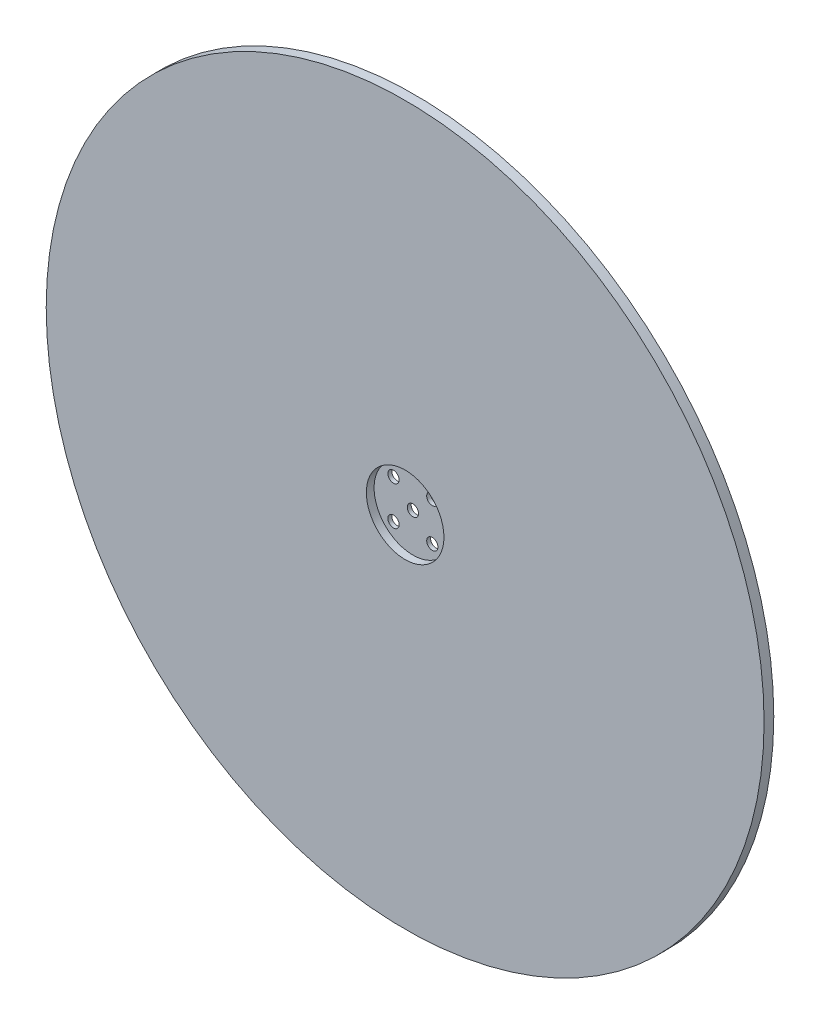
ISO-10303-21;
HEADER;
FILE_DESCRIPTION(('STEP AP214'),'2;1');
FILE_NAME('part.step','',(''),(''),'','','');
FILE_SCHEMA(('AUTOMOTIVE_DESIGN { 1 0 10303 214 1 1 1 1 }'));
ENDSEC;
DATA;
#1=APPLICATION_CONTEXT('core data for automotive mechanical design processes');
#2=APPLICATION_PROTOCOL_DEFINITION('international standard','automotive_design',2000,#1);
#3=PRODUCT_CONTEXT('',#1,'mechanical');
#4=PRODUCT('Part','Part','',(#3));
#5=PRODUCT_RELATED_PRODUCT_CATEGORY('part','',(#4));
#6=PRODUCT_DEFINITION_FORMATION('','',#4);
#7=PRODUCT_DEFINITION_CONTEXT('part definition',#1,'design');
#8=PRODUCT_DEFINITION('design','',#6,#7);
#9=PRODUCT_DEFINITION_SHAPE('','',#8);
#10=(LENGTH_UNIT() NAMED_UNIT(*) SI_UNIT(.MILLI.,.METRE.));
#11=(NAMED_UNIT(*) PLANE_ANGLE_UNIT() SI_UNIT($,.RADIAN.));
#12=(NAMED_UNIT(*) SI_UNIT($,.STERADIAN.) SOLID_ANGLE_UNIT());
#13=UNCERTAINTY_MEASURE_WITH_UNIT(LENGTH_MEASURE(1.E-05),#10,'distance_accuracy_value','');
#14=(GEOMETRIC_REPRESENTATION_CONTEXT(3) GLOBAL_UNCERTAINTY_ASSIGNED_CONTEXT((#13)) GLOBAL_UNIT_ASSIGNED_CONTEXT((#10,
#11,#12)) REPRESENTATION_CONTEXT('',''));
#15=CARTESIAN_POINT('',(0.,0.,0.));
#16=DIRECTION('',(0.,0.,1.));
#17=DIRECTION('',(1.,0.,0.));
#18=AXIS2_PLACEMENT_3D('',#15,#16,#17);
#19=CARTESIAN_POINT('',(-10.4999999999999,-61.233,-10.5000000000001));
#20=DIRECTION('',(1.,0.,0.));
#21=DIRECTION('',(0.,0.,-1.));
#22=AXIS2_PLACEMENT_3D('',#19,#20,#21);
#23=CYLINDRICAL_SURFACE('',#22,1.5);
#24=CARTESIAN_POINT('',(-2.49999999999993,-61.233,-10.5));
#25=DIRECTION('',(-1.,0.,0.));
#26=DIRECTION('',(0.,0.,1.));
#27=AXIS2_PLACEMENT_3D('',#24,#25,#26);
#28=CIRCLE('',#27,1.5);
#29=CARTESIAN_POINT('',(-2.49999999999994,-61.233,-9.00000000000002));
#30=VERTEX_POINT('',#29);
#31=EDGE_CURVE('E188',#30,#30,#28,.F.);
#32=ORIENTED_EDGE('',*,*,#31,.T.);
#33=EDGE_LOOP('',(#32));
#34=FACE_BOUND('',#33,.T.);
#35=CARTESIAN_POINT('',(-7.49999999999993,-61.233,-10.5000000000001));
#36=DIRECTION('',(-1.,0.,0.));
#37=DIRECTION('',(0.,0.,1.));
#38=AXIS2_PLACEMENT_3D('',#35,#36,#37);
#39=CIRCLE('',#38,1.5);
#40=CARTESIAN_POINT('',(-7.49999999999994,-61.233,-9.00000000000005));
#41=VERTEX_POINT('',#40);
#42=EDGE_CURVE('E547',#41,#41,#39,.F.);
#43=ORIENTED_EDGE('',*,*,#42,.F.);
#44=EDGE_LOOP('',(#43));
#45=FACE_BOUND('',#44,.T.);
#46=ADVANCED_FACE('F38',(#34,#45),#23,.F.);
#47=CARTESIAN_POINT('',(-10.4999999999999,64.767,-10.5000000000001));
#48=DIRECTION('',(1.,0.,0.));
#49=DIRECTION('',(0.,0.,-1.));
#50=AXIS2_PLACEMENT_3D('',#47,#48,#49);
#51=CYLINDRICAL_SURFACE('',#50,1.5);
#52=CARTESIAN_POINT('',(-2.49999999999993,64.767,-10.5));
#53=DIRECTION('',(-1.,0.,0.));
#54=DIRECTION('',(0.,0.,1.));
#55=AXIS2_PLACEMENT_3D('',#52,#53,#54);
#56=CIRCLE('',#55,1.5);
#57=CARTESIAN_POINT('',(-2.49999999999994,64.767,-9.00000000000002));
#58=VERTEX_POINT('',#57);
#59=EDGE_CURVE('E177',#58,#58,#56,.F.);
#60=ORIENTED_EDGE('',*,*,#59,.T.);
#61=EDGE_LOOP('',(#60));
#62=FACE_BOUND('',#61,.T.);
#63=CARTESIAN_POINT('',(-7.49999999999993,64.767,-10.5000000000001));
#64=DIRECTION('',(-1.,0.,0.));
#65=DIRECTION('',(0.,0.,1.));
#66=AXIS2_PLACEMENT_3D('',#63,#64,#65);
#67=CIRCLE('',#66,1.5);
#68=CARTESIAN_POINT('',(-7.49999999999994,64.767,-9.00000000000005));
#69=VERTEX_POINT('',#68);
#70=EDGE_CURVE('E42',#69,#69,#67,.F.);
#71=ORIENTED_EDGE('',*,*,#70,.F.);
#72=EDGE_LOOP('',(#71));
#73=FACE_BOUND('',#72,.T.);
#74=ADVANCED_FACE('F371',(#62,#73),#51,.F.);
#75=CARTESIAN_POINT('',(0.,0.,-1.));
#76=DIRECTION('',(0.,0.,1.));
#77=DIRECTION('',(1.,0.,0.));
#78=AXIS2_PLACEMENT_3D('',#75,#76,#77);
#79=CYLINDRICAL_SURFACE('',#78,1.45);
#80=CARTESIAN_POINT('',(0.,0.,-1.));
#81=DIRECTION('',(0.,0.,1.));
#82=DIRECTION('',(1.,0.,0.));
#83=AXIS2_PLACEMENT_3D('',#80,#81,#82);
#84=CIRCLE('',#83,1.45);
#85=CARTESIAN_POINT('',(1.45,0.,-1.));
#86=VERTEX_POINT('',#85);
#87=EDGE_CURVE('E234',#86,#86,#84,.T.);
#88=ORIENTED_EDGE('',*,*,#87,.F.);
#89=EDGE_LOOP('',(#88));
#90=FACE_BOUND('',#89,.T.);
#91=CARTESIAN_POINT('',(0.,0.,0.));
#92=DIRECTION('',(0.,0.,1.));
#93=DIRECTION('',(1.,0.,0.));
#94=AXIS2_PLACEMENT_3D('',#91,#92,#93);
#95=CIRCLE('',#94,1.45);
#96=CARTESIAN_POINT('',(1.45,0.,0.));
#97=VERTEX_POINT('',#96);
#98=EDGE_CURVE('E225',#97,#97,#95,.T.);
#99=ORIENTED_EDGE('',*,*,#98,.T.);
#100=EDGE_LOOP('',(#99));
#101=FACE_BOUND('',#100,.T.);
#102=ADVANCED_FACE('F377',(#90,#101),#79,.F.);
#103=CARTESIAN_POINT('',(-5.,5.,-1.));
#104=DIRECTION('',(0.,0.,1.));
#105=DIRECTION('',(1.,0.,0.));
#106=AXIS2_PLACEMENT_3D('',#103,#104,#105);
#107=CYLINDRICAL_SURFACE('',#106,1.45);
#108=CARTESIAN_POINT('',(-5.,5.,-1.));
#109=DIRECTION('',(0.,0.,1.));
#110=DIRECTION('',(1.,0.,0.));
#111=AXIS2_PLACEMENT_3D('',#108,#109,#110);
#112=CIRCLE('',#111,1.45);
#113=CARTESIAN_POINT('',(-3.55,5.,-1.));
#114=VERTEX_POINT('',#113);
#115=EDGE_CURVE('E231',#114,#114,#112,.T.);
#116=ORIENTED_EDGE('',*,*,#115,.F.);
#117=EDGE_LOOP('',(#116));
#118=FACE_BOUND('',#117,.T.);
#119=CARTESIAN_POINT('',(-5.,5.,0.));
#120=DIRECTION('',(0.,0.,1.));
#121=DIRECTION('',(1.,0.,0.));
#122=AXIS2_PLACEMENT_3D('',#119,#120,#121);
#123=CIRCLE('',#122,1.45);
#124=CARTESIAN_POINT('',(-3.55,5.,0.));
#125=VERTEX_POINT('',#124);
#126=EDGE_CURVE('E249',#125,#125,#123,.T.);
#127=ORIENTED_EDGE('',*,*,#126,.T.);
#128=EDGE_LOOP('',(#127));
#129=FACE_BOUND('',#128,.T.);
#130=ADVANCED_FACE('F424',(#118,#129),#107,.F.);
#131=CARTESIAN_POINT('',(5.,5.,-1.));
#132=DIRECTION('',(0.,0.,1.));
#133=DIRECTION('',(1.,0.,0.));
#134=AXIS2_PLACEMENT_3D('',#131,#132,#133);
#135=CYLINDRICAL_SURFACE('',#134,1.45);
#136=CARTESIAN_POINT('',(5.,5.,-1.));
#137=DIRECTION('',(0.,0.,1.));
#138=DIRECTION('',(1.,0.,0.));
#139=AXIS2_PLACEMENT_3D('',#136,#137,#138);
#140=CIRCLE('',#139,1.45);
#141=CARTESIAN_POINT('',(6.45,5.,-1.));
#142=VERTEX_POINT('',#141);
#143=EDGE_CURVE('E228',#142,#142,#140,.T.);
#144=ORIENTED_EDGE('',*,*,#143,.F.);
#145=EDGE_LOOP('',(#144));
#146=FACE_BOUND('',#145,.T.);
#147=CARTESIAN_POINT('',(5.,5.,0.));
#148=DIRECTION('',(0.,0.,1.));
#149=DIRECTION('',(1.,0.,0.));
#150=AXIS2_PLACEMENT_3D('',#147,#148,#149);
#151=CIRCLE('',#150,1.45);
#152=CARTESIAN_POINT('',(6.45,5.,0.));
#153=VERTEX_POINT('',#152);
#154=EDGE_CURVE('E246',#153,#153,#151,.T.);
#155=ORIENTED_EDGE('',*,*,#154,.T.);
#156=EDGE_LOOP('',(#155));
#157=FACE_BOUND('',#156,.T.);
#158=ADVANCED_FACE('F428',(#146,#157),#135,.F.);
#159=CARTESIAN_POINT('',(5.,-5.,-1.));
#160=DIRECTION('',(0.,0.,1.));
#161=DIRECTION('',(1.,0.,0.));
#162=AXIS2_PLACEMENT_3D('',#159,#160,#161);
#163=CYLINDRICAL_SURFACE('',#162,1.45);
#164=CARTESIAN_POINT('',(5.,-5.,-1.));
#165=DIRECTION('',(0.,0.,1.));
#166=DIRECTION('',(1.,0.,0.));
#167=AXIS2_PLACEMENT_3D('',#164,#165,#166);
#168=CIRCLE('',#167,1.45);
#169=CARTESIAN_POINT('',(6.45,-5.,-1.));
#170=VERTEX_POINT('',#169);
#171=EDGE_CURVE('E224',#170,#170,#168,.T.);
#172=ORIENTED_EDGE('',*,*,#171,.F.);
#173=EDGE_LOOP('',(#172));
#174=FACE_BOUND('',#173,.T.);
#175=CARTESIAN_POINT('',(5.,-5.,0.));
#176=DIRECTION('',(0.,0.,1.));
#177=DIRECTION('',(1.,0.,0.));
#178=AXIS2_PLACEMENT_3D('',#175,#176,#177);
#179=CIRCLE('',#178,1.45);
#180=CARTESIAN_POINT('',(6.45,-5.,0.));
#181=VERTEX_POINT('',#180);
#182=EDGE_CURVE('E243',#181,#181,#179,.T.);
#183=ORIENTED_EDGE('',*,*,#182,.T.);
#184=EDGE_LOOP('',(#183));
#185=FACE_BOUND('',#184,.T.);
#186=ADVANCED_FACE('F431',(#174,#185),#163,.F.);
#187=CARTESIAN_POINT('',(-5.,-5.,-1.));
#188=DIRECTION('',(0.,0.,1.));
#189=DIRECTION('',(1.,0.,0.));
#190=AXIS2_PLACEMENT_3D('',#187,#188,#189);
#191=CYLINDRICAL_SURFACE('',#190,1.45);
#192=CARTESIAN_POINT('',(-5.,-5.,-1.));
#193=DIRECTION('',(0.,0.,1.));
#194=DIRECTION('',(1.,0.,0.));
#195=AXIS2_PLACEMENT_3D('',#192,#193,#194);
#196=CIRCLE('',#195,1.45);
#197=CARTESIAN_POINT('',(-3.55,-5.,-1.));
#198=VERTEX_POINT('',#197);
#199=EDGE_CURVE('E221',#198,#198,#196,.T.);
#200=ORIENTED_EDGE('',*,*,#199,.F.);
#201=EDGE_LOOP('',(#200));
#202=FACE_BOUND('',#201,.T.);
#203=CARTESIAN_POINT('',(-5.,-5.,0.));
#204=DIRECTION('',(0.,0.,1.));
#205=DIRECTION('',(1.,0.,0.));
#206=AXIS2_PLACEMENT_3D('',#203,#204,#205);
#207=CIRCLE('',#206,1.45);
#208=CARTESIAN_POINT('',(-3.55,-5.,0.));
#209=VERTEX_POINT('',#208);
#210=EDGE_CURVE('E220',#209,#209,#207,.T.);
#211=ORIENTED_EDGE('',*,*,#210,.T.);
#212=EDGE_LOOP('',(#211));
#213=FACE_BOUND('',#212,.T.);
#214=ADVANCED_FACE('F333',(#202,#213),#191,.F.);
#215=CARTESIAN_POINT('',(0.,0.,-1.));
#216=DIRECTION('',(0.,0.,1.));
#217=DIRECTION('',(1.,0.,0.));
#218=AXIS2_PLACEMENT_3D('',#215,#216,#217);
#219=PLANE('',#218);
#220=ORIENTED_EDGE('',*,*,#199,.T.);
#221=EDGE_LOOP('',(#220));
#222=FACE_BOUND('',#221,.T.);
#223=ORIENTED_EDGE('',*,*,#171,.T.);
#224=EDGE_LOOP('',(#223));
#225=FACE_BOUND('',#224,.T.);
#226=ORIENTED_EDGE('',*,*,#143,.T.);
#227=EDGE_LOOP('',(#226));
#228=FACE_BOUND('',#227,.T.);
#229=ORIENTED_EDGE('',*,*,#115,.T.);
#230=EDGE_LOOP('',(#229));
#231=FACE_BOUND('',#230,.T.);
#232=ORIENTED_EDGE('',*,*,#87,.T.);
#233=EDGE_LOOP('',(#232));
#234=FACE_BOUND('',#233,.T.);
#235=CARTESIAN_POINT('',(0.,0.,-1.));
#236=DIRECTION('',(0.,0.,1.));
#237=DIRECTION('',(1.,0.,0.));
#238=AXIS2_PLACEMENT_3D('',#235,#236,#237);
#239=CIRCLE('',#238,10.);
#240=CARTESIAN_POINT('',(10.,0.,-1.));
#241=VERTEX_POINT('',#240);
#242=EDGE_CURVE('E237',#241,#241,#239,.T.);
#243=ORIENTED_EDGE('',*,*,#242,.F.);
#244=EDGE_LOOP('',(#243));
#245=FACE_BOUND('',#244,.T.);
#246=ADVANCED_FACE('F415',(#222,#225,#228,#231,#234,#245),#219,.F.);
#247=CARTESIAN_POINT('',(0.,0.,0.));
#248=DIRECTION('',(0.,0.,1.));
#249=DIRECTION('',(1.,0.,0.));
#250=AXIS2_PLACEMENT_3D('',#247,#248,#249);
#251=PLANE('',#250);
#252=ORIENTED_EDGE('',*,*,#210,.F.);
#253=EDGE_LOOP('',(#252));
#254=FACE_BOUND('',#253,.T.);
#255=ORIENTED_EDGE('',*,*,#182,.F.);
#256=EDGE_LOOP('',(#255));
#257=FACE_BOUND('',#256,.T.);
#258=ORIENTED_EDGE('',*,*,#154,.F.);
#259=EDGE_LOOP('',(#258));
#260=FACE_BOUND('',#259,.T.);
#261=ORIENTED_EDGE('',*,*,#126,.F.);
#262=EDGE_LOOP('',(#261));
#263=FACE_BOUND('',#262,.T.);
#264=ORIENTED_EDGE('',*,*,#98,.F.);
#265=EDGE_LOOP('',(#264));
#266=FACE_BOUND('',#265,.T.);
#267=CARTESIAN_POINT('',(0.,0.,0.));
#268=DIRECTION('',(0.,0.,1.));
#269=DIRECTION('',(1.,0.,0.));
#270=AXIS2_PLACEMENT_3D('',#267,#268,#269);
#271=CIRCLE('',#270,10.);
#272=CARTESIAN_POINT('',(10.,0.,0.));
#273=VERTEX_POINT('',#272);
#274=EDGE_CURVE('E217',#273,#273,#271,.T.);
#275=ORIENTED_EDGE('',*,*,#274,.T.);
#276=EDGE_LOOP('',(#275));
#277=FACE_BOUND('',#276,.T.);
#278=ADVANCED_FACE('F413',(#254,#257,#260,#263,#266,#277),#251,.T.);
#279=CARTESIAN_POINT('',(0.,0.,-0.5));
#280=DIRECTION('',(0.,0.,1.));
#281=DIRECTION('',(1.,0.,0.));
#282=AXIS2_PLACEMENT_3D('',#279,#280,#281);
#283=CYLINDRICAL_SURFACE('',#282,10.);
#284=ORIENTED_EDGE('',*,*,#274,.F.);
#285=EDGE_LOOP('',(#284));
#286=FACE_BOUND('',#285,.T.);
#287=CARTESIAN_POINT('',(0.,0.,2.));
#288=DIRECTION('',(0.,0.,1.));
#289=DIRECTION('',(1.,0.,0.));
#290=AXIS2_PLACEMENT_3D('',#287,#288,#289);
#291=CIRCLE('',#290,10.);
#292=CARTESIAN_POINT('',(10.,0.,2.));
#293=VERTEX_POINT('',#292);
#294=EDGE_CURVE('E208',#293,#293,#291,.T.);
#295=ORIENTED_EDGE('',*,*,#294,.T.);
#296=EDGE_LOOP('',(#295));
#297=FACE_BOUND('',#296,.T.);
#298=ADVANCED_FACE('F409',(#286,#297),#283,.F.);
#299=CARTESIAN_POINT('',(0.,0.,-0.5));
#300=DIRECTION('',(0.,0.,1.));
#301=DIRECTION('',(1.,0.,0.));
#302=AXIS2_PLACEMENT_3D('',#299,#300,#301);
#303=CYLINDRICAL_SURFACE('',#302,92.5);
#304=CARTESIAN_POINT('',(0.,0.,-0.5));
#305=DIRECTION('',(0.,0.,1.));
#306=DIRECTION('',(1.,0.,0.));
#307=AXIS2_PLACEMENT_3D('',#304,#305,#306);
#308=CIRCLE('',#307,92.5);
#309=CARTESIAN_POINT('',(92.5,0.,-0.5));
#310=VERTEX_POINT('',#309);
#311=EDGE_CURVE('E214',#310,#310,#308,.T.);
#312=ORIENTED_EDGE('',*,*,#311,.T.);
#313=EDGE_LOOP('',(#312));
#314=FACE_BOUND('',#313,.T.);
#315=CARTESIAN_POINT('',(0.,0.,2.));
#316=DIRECTION('',(0.,0.,1.));
#317=DIRECTION('',(1.,0.,0.));
#318=AXIS2_PLACEMENT_3D('',#315,#316,#317);
#319=CIRCLE('',#318,92.5);
#320=CARTESIAN_POINT('',(92.5,0.,2.));
#321=VERTEX_POINT('',#320);
#322=EDGE_CURVE('E211',#321,#321,#319,.T.);
#323=ORIENTED_EDGE('',*,*,#322,.F.);
#324=EDGE_LOOP('',(#323));
#325=FACE_BOUND('',#324,.T.);
#326=ADVANCED_FACE('F405',(#314,#325),#303,.T.);
#327=CARTESIAN_POINT('',(0.,0.,-0.5));
#328=DIRECTION('',(0.,0.,1.));
#329=DIRECTION('',(1.,0.,0.));
#330=AXIS2_PLACEMENT_3D('',#327,#328,#329);
#331=PLANE('',#330);
#332=CARTESIAN_POINT('',(0.,0.,-0.5));
#333=DIRECTION('',(0.,0.,1.));
#334=DIRECTION('',(1.,0.,0.));
#335=AXIS2_PLACEMENT_3D('',#332,#333,#334);
#336=CIRCLE('',#335,10.8660254037844);
#337=CARTESIAN_POINT('',(10.8660254037844,0.,-0.5));
#338=VERTEX_POINT('',#337);
#339=EDGE_CURVE('E293',#338,#338,#336,.T.);
#340=ORIENTED_EDGE('',*,*,#339,.T.);
#341=EDGE_LOOP('',(#340));
#342=FACE_BOUND('',#341,.T.);
#343=DIRECTION('',(1.,0.,0.));
#344=VECTOR('',#343,1.);
#345=CARTESIAN_POINT('',(0.,69.767,-0.5));
#346=LINE('',#345,#344);
#347=CARTESIAN_POINT('',(-1.49999999999999,69.767,-0.5));
#348=VERTEX_POINT('',#347);
#349=CARTESIAN_POINT('',(-15.5,69.767,-0.5));
#350=VERTEX_POINT('',#349);
#351=EDGE_CURVE('E301',#348,#350,#346,.F.);
#352=ORIENTED_EDGE('',*,*,#351,.T.);
#353=DIRECTION('',(0.,1.,0.));
#354=VECTOR('',#353,1.);
#355=CARTESIAN_POINT('',(-15.5,0.,-0.5));
#356=LINE('',#355,#354);
#357=CARTESIAN_POINT('',(-15.5,55.767,-0.5));
#358=VERTEX_POINT('',#357);
#359=EDGE_CURVE('E263',#350,#358,#356,.F.);
#360=ORIENTED_EDGE('',*,*,#359,.T.);
#361=DIRECTION('',(1.,0.,0.));
#362=VECTOR('',#361,1.);
#363=CARTESIAN_POINT('',(-2.5,55.767,-0.5));
#364=LINE('',#363,#362);
#365=CARTESIAN_POINT('',(-1.49999999999999,55.767,-0.5));
#366=VERTEX_POINT('',#365);
#367=EDGE_CURVE('E261',#358,#366,#364,.T.);
#368=ORIENTED_EDGE('',*,*,#367,.T.);
#369=DIRECTION('',(0.,1.,0.));
#370=VECTOR('',#369,1.);
#371=CARTESIAN_POINT('',(-1.49999999999999,68.767,-0.5));
#372=LINE('',#371,#370);
#373=EDGE_CURVE('E299',#366,#348,#372,.T.);
#374=ORIENTED_EDGE('',*,*,#373,.T.);
#375=EDGE_LOOP('',(#352,#360,#368,#374));
#376=FACE_BOUND('',#375,.T.);
#377=DIRECTION('',(0.,1.,0.));
#378=VECTOR('',#377,1.);
#379=CARTESIAN_POINT('',(-1.49999999999999,-52.233,-0.5));
#380=LINE('',#379,#378);
#381=CARTESIAN_POINT('',(-1.49999999999999,-70.233,-0.5));
#382=VERTEX_POINT('',#381);
#383=CARTESIAN_POINT('',(-1.49999999999999,-52.233,-0.5));
#384=VERTEX_POINT('',#383);
#385=EDGE_CURVE('E296',#382,#384,#380,.T.);
#386=ORIENTED_EDGE('',*,*,#385,.T.);
#387=DIRECTION('',(1.,0.,0.));
#388=VECTOR('',#387,1.);
#389=CARTESIAN_POINT('',(0.,-52.233,-0.5));
#390=LINE('',#389,#388);
#391=CARTESIAN_POINT('',(-15.5,-52.233,-0.5));
#392=VERTEX_POINT('',#391);
#393=EDGE_CURVE('E259',#384,#392,#390,.F.);
#394=ORIENTED_EDGE('',*,*,#393,.T.);
#395=DIRECTION('',(0.,1.,0.));
#396=VECTOR('',#395,1.);
#397=CARTESIAN_POINT('',(-15.5,0.,-0.5));
#398=LINE('',#397,#396);
#399=CARTESIAN_POINT('',(-15.5,-70.233,-0.5));
#400=VERTEX_POINT('',#399);
#401=EDGE_CURVE('E257',#392,#400,#398,.F.);
#402=ORIENTED_EDGE('',*,*,#401,.T.);
#403=DIRECTION('',(1.,0.,0.));
#404=VECTOR('',#403,1.);
#405=CARTESIAN_POINT('',(-2.5,-70.233,-0.5));
#406=LINE('',#405,#404);
#407=EDGE_CURVE('E255',#400,#382,#406,.T.);
#408=ORIENTED_EDGE('',*,*,#407,.T.);
#409=EDGE_LOOP('',(#386,#394,#402,#408));
#410=FACE_BOUND('',#409,.T.);
#411=ORIENTED_EDGE('',*,*,#311,.F.);
#412=EDGE_LOOP('',(#411));
#413=FACE_BOUND('',#412,.T.);
#414=ADVANCED_FACE('F401',(#342,#376,#410,#413),#331,.F.);
#415=CARTESIAN_POINT('',(0.,0.,2.));
#416=DIRECTION('',(0.,0.,1.));
#417=DIRECTION('',(1.,0.,0.));
#418=AXIS2_PLACEMENT_3D('',#415,#416,#417);
#419=PLANE('',#418);
#420=ORIENTED_EDGE('',*,*,#294,.F.);
#421=EDGE_LOOP('',(#420));
#422=FACE_BOUND('',#421,.T.);
#423=ORIENTED_EDGE('',*,*,#322,.T.);
#424=EDGE_LOOP('',(#423));
#425=FACE_BOUND('',#424,.T.);
#426=ADVANCED_FACE('F397',(#422,#425),#419,.T.);
#427=CARTESIAN_POINT('',(-10.5,-57.233,0.));
#428=DIRECTION('',(0.,1.,0.));
#429=DIRECTION('',(0.,0.,1.));
#430=AXIS2_PLACEMENT_3D('',#427,#428,#429);
#431=PLANE('',#430);
#432=DIRECTION('',(0.,0.,1.));
#433=VECTOR('',#432,1.);
#434=CARTESIAN_POINT('',(-10.5,-57.233,0.));
#435=LINE('',#434,#433);
#436=CARTESIAN_POINT('',(-10.4999999999999,-57.233,-10.5000000000001));
#437=VERTEX_POINT('',#436);
#438=CARTESIAN_POINT('',(-10.5,-57.233,-5.5));
#439=VERTEX_POINT('',#438);
#440=EDGE_CURVE('E184',#437,#439,#435,.T.);
#441=ORIENTED_EDGE('',*,*,#440,.T.);
#442=DIRECTION('',(1.,0.,0.));
#443=VECTOR('',#442,1.);
#444=CARTESIAN_POINT('',(-10.5,-57.233,-5.5));
#445=LINE('',#444,#443);
#446=CARTESIAN_POINT('',(-2.49999999999996,-57.233,-5.5));
#447=VERTEX_POINT('',#446);
#448=EDGE_CURVE('E269',#439,#447,#445,.T.);
#449=ORIENTED_EDGE('',*,*,#448,.T.);
#450=DIRECTION('',(0.,0.,1.));
#451=VECTOR('',#450,1.);
#452=CARTESIAN_POINT('',(-2.5,-57.233,0.));
#453=LINE('',#452,#451);
#454=CARTESIAN_POINT('',(-2.49999999999993,-57.233,-10.5));
#455=VERTEX_POINT('',#454);
#456=EDGE_CURVE('E152',#455,#447,#453,.T.);
#457=ORIENTED_EDGE('',*,*,#456,.F.);
#458=DIRECTION('',(1.,0.,0.));
#459=VECTOR('',#458,1.);
#460=CARTESIAN_POINT('',(-10.4999999999999,-57.233,-10.5000000000001));
#461=LINE('',#460,#459);
#462=EDGE_CURVE('E206',#437,#455,#461,.T.);
#463=ORIENTED_EDGE('',*,*,#462,.F.);
#464=EDGE_LOOP('',(#441,#449,#457,#463));
#465=FACE_BOUND('',#464,.T.);
#466=ADVANCED_FACE('F393',(#465),#431,.T.);
#467=CARTESIAN_POINT('',(-10.4999999999999,-61.233,-10.5000000000001));
#468=DIRECTION('',(1.,0.,0.));
#469=DIRECTION('',(0.,0.,-1.));
#470=AXIS2_PLACEMENT_3D('',#467,#468,#469);
#471=CYLINDRICAL_SURFACE('',#470,4.);
#472=CARTESIAN_POINT('',(-2.49999999999993,-61.233,-10.5));
#473=DIRECTION('',(-1.,0.,0.));
#474=DIRECTION('',(0.,0.,1.));
#475=AXIS2_PLACEMENT_3D('',#472,#473,#474);
#476=CIRCLE('',#475,4.);
#477=CARTESIAN_POINT('',(-2.49999999999993,-65.233,-10.5));
#478=VERTEX_POINT('',#477);
#479=EDGE_CURVE('E197',#478,#455,#476,.F.);
#480=ORIENTED_EDGE('',*,*,#479,.F.);
#481=DIRECTION('',(1.,0.,0.));
#482=VECTOR('',#481,1.);
#483=CARTESIAN_POINT('',(-10.4999999999999,-65.233,-10.5000000000001));
#484=LINE('',#483,#482);
#485=CARTESIAN_POINT('',(-10.4999999999999,-65.233,-10.5000000000001));
#486=VERTEX_POINT('',#485);
#487=EDGE_CURVE('E194',#486,#478,#484,.T.);
#488=ORIENTED_EDGE('',*,*,#487,.F.);
#489=CARTESIAN_POINT('',(-10.4999999999999,-61.233,-10.5000000000001));
#490=DIRECTION('',(-1.,0.,0.));
#491=DIRECTION('',(0.,0.,1.));
#492=AXIS2_PLACEMENT_3D('',#489,#490,#491);
#493=CIRCLE('',#492,4.);
#494=EDGE_CURVE('E187',#486,#437,#493,.F.);
#495=ORIENTED_EDGE('',*,*,#494,.T.);
#496=ORIENTED_EDGE('',*,*,#462,.T.);
#497=EDGE_LOOP('',(#480,#488,#495,#496));
#498=FACE_BOUND('',#497,.T.);
#499=ADVANCED_FACE('F389',(#498),#471,.T.);
#500=CARTESIAN_POINT('',(-10.5,-65.233,0.));
#501=DIRECTION('',(0.,1.,0.));
#502=DIRECTION('',(0.,0.,1.));
#503=AXIS2_PLACEMENT_3D('',#500,#501,#502);
#504=PLANE('',#503);
#505=DIRECTION('',(0.,0.,1.));
#506=VECTOR('',#505,1.);
#507=CARTESIAN_POINT('',(-2.5,-65.233,0.));
#508=LINE('',#507,#506);
#509=CARTESIAN_POINT('',(-2.49999999999996,-65.233,-5.5));
#510=VERTEX_POINT('',#509);
#511=EDGE_CURVE('E200',#478,#510,#508,.T.);
#512=ORIENTED_EDGE('',*,*,#511,.T.);
#513=DIRECTION('',(1.,0.,0.));
#514=VECTOR('',#513,1.);
#515=CARTESIAN_POINT('',(-10.5,-65.233,-5.5));
#516=LINE('',#515,#514);
#517=CARTESIAN_POINT('',(-10.5,-65.233,-5.5));
#518=VERTEX_POINT('',#517);
#519=EDGE_CURVE('E271',#510,#518,#516,.F.);
#520=ORIENTED_EDGE('',*,*,#519,.T.);
#521=DIRECTION('',(0.,0.,1.));
#522=VECTOR('',#521,1.);
#523=CARTESIAN_POINT('',(-10.5,-65.233,0.));
#524=LINE('',#523,#522);
#525=EDGE_CURVE('E191',#486,#518,#524,.T.);
#526=ORIENTED_EDGE('',*,*,#525,.F.);
#527=ORIENTED_EDGE('',*,*,#487,.T.);
#528=EDGE_LOOP('',(#512,#520,#526,#527));
#529=FACE_BOUND('',#528,.T.);
#530=ADVANCED_FACE('F385',(#529),#504,.F.);
#531=CARTESIAN_POINT('',(-10.5,0.,0.));
#532=DIRECTION('',(-1.,0.,0.));
#533=DIRECTION('',(0.,0.,1.));
#534=AXIS2_PLACEMENT_3D('',#531,#532,#533);
#535=PLANE('',#534);
#536=CARTESIAN_POINT('',(-10.4999999999999,-61.233,-10.5000000000001));
#537=DIRECTION('',(-1.,0.,0.));
#538=DIRECTION('',(0.,0.,1.));
#539=AXIS2_PLACEMENT_3D('',#536,#537,#538);
#540=CIRCLE('',#539,2.75);
#541=CARTESIAN_POINT('',(-10.4999999999999,-61.233,-7.75000000000007));
#542=VERTEX_POINT('',#541);
#543=EDGE_CURVE('E173',#542,#542,#540,.T.);
#544=ORIENTED_EDGE('',*,*,#543,.F.);
#545=EDGE_LOOP('',(#544));
#546=FACE_BOUND('',#545,.T.);
#547=ORIENTED_EDGE('',*,*,#525,.T.);
#548=DIRECTION('',(0.,1.,0.));
#549=VECTOR('',#548,1.);
#550=CARTESIAN_POINT('',(-10.5,0.,-5.49999999999997));
#551=LINE('',#550,#549);
#552=EDGE_CURVE('E266',#518,#439,#551,.T.);
#553=ORIENTED_EDGE('',*,*,#552,.T.);
#554=ORIENTED_EDGE('',*,*,#440,.F.);
#555=ORIENTED_EDGE('',*,*,#494,.F.);
#556=EDGE_LOOP('',(#547,#553,#554,#555));
#557=FACE_BOUND('',#556,.T.);
#558=ADVANCED_FACE('F388',(#546,#557),#535,.T.);
#559=CARTESIAN_POINT('',(-2.5,0.,0.));
#560=DIRECTION('',(-1.,0.,0.));
#561=DIRECTION('',(0.,0.,1.));
#562=AXIS2_PLACEMENT_3D('',#559,#560,#561);
#563=PLANE('',#562);
#564=CARTESIAN_POINT('',(-2.49999999999996,-52.233,-5.5));
#565=DIRECTION('',(-1.,0.,0.));
#566=DIRECTION('',(0.,0.,1.));
#567=AXIS2_PLACEMENT_3D('',#564,#565,#566);
#568=CIRCLE('',#567,5.);
#569=CARTESIAN_POINT('',(-2.49999999999999,-55.233,-1.50000000000001));
#570=VERTEX_POINT('',#569);
#571=EDGE_CURVE('E278',#447,#570,#568,.T.);
#572=ORIENTED_EDGE('',*,*,#571,.T.);
#573=DIRECTION('',(0.,1.,0.));
#574=VECTOR('',#573,1.);
#575=CARTESIAN_POINT('',(-2.49999999999999,-70.233,-1.50000000000001));
#576=LINE('',#575,#574);
#577=CARTESIAN_POINT('',(-2.49999999999999,-67.233,-1.5));
#578=VERTEX_POINT('',#577);
#579=EDGE_CURVE('E55',#570,#578,#576,.F.);
#580=ORIENTED_EDGE('',*,*,#579,.T.);
#581=CARTESIAN_POINT('',(-2.49999999999996,-70.233,-5.5));
#582=DIRECTION('',(-1.,0.,0.));
#583=DIRECTION('',(0.,0.,1.));
#584=AXIS2_PLACEMENT_3D('',#581,#582,#583);
#585=CIRCLE('',#584,5.);
#586=EDGE_CURVE('E280',#578,#510,#585,.T.);
#587=ORIENTED_EDGE('',*,*,#586,.T.);
#588=ORIENTED_EDGE('',*,*,#511,.F.);
#589=ORIENTED_EDGE('',*,*,#479,.T.);
#590=ORIENTED_EDGE('',*,*,#456,.T.);
#591=EDGE_LOOP('',(#572,#580,#587,#588,#589,#590));
#592=FACE_BOUND('',#591,.T.);
#593=ORIENTED_EDGE('',*,*,#31,.F.);
#594=EDGE_LOOP('',(#593));
#595=FACE_BOUND('',#594,.T.);
#596=ADVANCED_FACE('F383',(#592,#595),#563,.F.);
#597=CARTESIAN_POINT('',(-10.4999999999999,64.767,-10.5000000000001));
#598=DIRECTION('',(1.,0.,0.));
#599=DIRECTION('',(0.,0.,-1.));
#600=AXIS2_PLACEMENT_3D('',#597,#598,#599);
#601=CYLINDRICAL_SURFACE('',#600,4.);
#602=CARTESIAN_POINT('',(-2.49999999999993,64.767,-10.5));
#603=DIRECTION('',(-1.,0.,0.));
#604=DIRECTION('',(0.,0.,1.));
#605=AXIS2_PLACEMENT_3D('',#602,#603,#604);
#606=CIRCLE('',#605,4.);
#607=CARTESIAN_POINT('',(-2.49999999999993,60.767,-10.5));
#608=VERTEX_POINT('',#607);
#609=CARTESIAN_POINT('',(-2.49999999999993,68.767,-10.5));
#610=VERTEX_POINT('',#609);
#611=EDGE_CURVE('E148',#608,#610,#606,.F.);
#612=ORIENTED_EDGE('',*,*,#611,.F.);
#613=DIRECTION('',(1.,0.,0.));
#614=VECTOR('',#613,1.);
#615=CARTESIAN_POINT('',(-10.4999999999999,60.767,-10.5000000000001));
#616=LINE('',#615,#614);
#617=CARTESIAN_POINT('',(-10.4999999999999,60.767,-10.5000000000001));
#618=VERTEX_POINT('',#617);
#619=EDGE_CURVE('E141',#618,#608,#616,.T.);
#620=ORIENTED_EDGE('',*,*,#619,.F.);
#621=CARTESIAN_POINT('',(-10.4999999999999,64.767,-10.5000000000001));
#622=DIRECTION('',(-1.,0.,0.));
#623=DIRECTION('',(0.,0.,1.));
#624=AXIS2_PLACEMENT_3D('',#621,#622,#623);
#625=CIRCLE('',#624,4.);
#626=CARTESIAN_POINT('',(-10.4999999999999,68.767,-10.5000000000001));
#627=VERTEX_POINT('',#626);
#628=EDGE_CURVE('E145',#618,#627,#625,.F.);
#629=ORIENTED_EDGE('',*,*,#628,.T.);
#630=DIRECTION('',(1.,0.,0.));
#631=VECTOR('',#630,1.);
#632=CARTESIAN_POINT('',(-10.4999999999999,68.767,-10.5000000000001));
#633=LINE('',#632,#631);
#634=EDGE_CURVE('E153',#627,#610,#633,.T.);
#635=ORIENTED_EDGE('',*,*,#634,.T.);
#636=EDGE_LOOP('',(#612,#620,#629,#635));
#637=FACE_BOUND('',#636,.T.);
#638=ADVANCED_FACE('F143',(#637),#601,.T.);
#639=CARTESIAN_POINT('',(-10.5,60.767,0.));
#640=DIRECTION('',(0.,1.,0.));
#641=DIRECTION('',(0.,0.,1.));
#642=AXIS2_PLACEMENT_3D('',#639,#640,#641);
#643=PLANE('',#642);
#644=DIRECTION('',(0.,0.,1.));
#645=VECTOR('',#644,1.);
#646=CARTESIAN_POINT('',(-2.5,60.767,0.));
#647=LINE('',#646,#645);
#648=CARTESIAN_POINT('',(-2.49999999999996,60.767,-5.5));
#649=VERTEX_POINT('',#648);
#650=EDGE_CURVE('E170',#608,#649,#647,.T.);
#651=ORIENTED_EDGE('',*,*,#650,.T.);
#652=DIRECTION('',(1.,0.,0.));
#653=VECTOR('',#652,1.);
#654=CARTESIAN_POINT('',(-10.5,60.767,-5.5));
#655=LINE('',#654,#653);
#656=CARTESIAN_POINT('',(-10.5,60.767,-5.5));
#657=VERTEX_POINT('',#656);
#658=EDGE_CURVE('E159',#649,#657,#655,.F.);
#659=ORIENTED_EDGE('',*,*,#658,.T.);
#660=DIRECTION('',(0.,0.,1.));
#661=VECTOR('',#660,1.);
#662=CARTESIAN_POINT('',(-10.5,60.767,0.));
#663=LINE('',#662,#661);
#664=EDGE_CURVE('E156',#618,#657,#663,.T.);
#665=ORIENTED_EDGE('',*,*,#664,.F.);
#666=ORIENTED_EDGE('',*,*,#619,.T.);
#667=EDGE_LOOP('',(#651,#659,#665,#666));
#668=FACE_BOUND('',#667,.T.);
#669=ADVANCED_FACE('F157',(#668),#643,.F.);
#670=CARTESIAN_POINT('',(-10.5,68.767,0.));
#671=DIRECTION('',(0.,1.,0.));
#672=DIRECTION('',(0.,0.,1.));
#673=AXIS2_PLACEMENT_3D('',#670,#671,#672);
#674=PLANE('',#673);
#675=CARTESIAN_POINT('',(-15.5,68.767,-5.5));
#676=DIRECTION('',(0.,1.,0.));
#677=DIRECTION('',(0.,0.,1.));
#678=AXIS2_PLACEMENT_3D('',#675,#676,#677);
#679=CIRCLE('',#678,5.);
#680=CARTESIAN_POINT('',(-10.5,68.767,-5.49999999999997));
#681=VERTEX_POINT('',#680);
#682=CARTESIAN_POINT('',(-12.5,68.767,-1.5));
#683=VERTEX_POINT('',#682);
#684=EDGE_CURVE('E273',#681,#683,#679,.F.);
#685=ORIENTED_EDGE('',*,*,#684,.T.);
#686=DIRECTION('',(1.,0.,0.));
#687=VECTOR('',#686,1.);
#688=CARTESIAN_POINT('',(-10.5,68.767,-1.5));
#689=LINE('',#688,#687);
#690=CARTESIAN_POINT('',(-2.49999999999999,68.767,-1.50000000000001));
#691=VERTEX_POINT('',#690);
#692=EDGE_CURVE('E282',#683,#691,#689,.T.);
#693=ORIENTED_EDGE('',*,*,#692,.T.);
#694=DIRECTION('',(0.,0.,1.));
#695=VECTOR('',#694,1.);
#696=CARTESIAN_POINT('',(-2.5,68.767,0.));
#697=LINE('',#696,#695);
#698=EDGE_CURVE('E167',#610,#691,#697,.T.);
#699=ORIENTED_EDGE('',*,*,#698,.F.);
#700=ORIENTED_EDGE('',*,*,#634,.F.);
#701=DIRECTION('',(0.,0.,1.));
#702=VECTOR('',#701,1.);
#703=CARTESIAN_POINT('',(-10.5,68.767,0.));
#704=LINE('',#703,#702);
#705=EDGE_CURVE('E163',#627,#681,#704,.T.);
#706=ORIENTED_EDGE('',*,*,#705,.T.);
#707=EDGE_LOOP('',(#685,#693,#699,#700,#706));
#708=FACE_BOUND('',#707,.T.);
#709=ADVANCED_FACE('F508',(#708),#674,.T.);
#710=CARTESIAN_POINT('',(-10.5,0.,0.));
#711=DIRECTION('',(-1.,0.,0.));
#712=DIRECTION('',(0.,0.,1.));
#713=AXIS2_PLACEMENT_3D('',#710,#711,#712);
#714=PLANE('',#713);
#715=CARTESIAN_POINT('',(-10.4999999999999,64.767,-10.4999999999995));
#716=DIRECTION('',(-1.,0.,0.));
#717=DIRECTION('',(0.,0.,1.));
#718=AXIS2_PLACEMENT_3D('',#715,#716,#717);
#719=CIRCLE('',#718,2.75);
#720=CARTESIAN_POINT('',(-10.4999999999999,64.767,-7.74999999999953));
#721=VERTEX_POINT('',#720);
#722=EDGE_CURVE('E541',#721,#721,#719,.T.);
#723=ORIENTED_EDGE('',*,*,#722,.F.);
#724=EDGE_LOOP('',(#723));
#725=FACE_BOUND('',#724,.T.);
#726=ORIENTED_EDGE('',*,*,#664,.T.);
#727=DIRECTION('',(0.,1.,0.));
#728=VECTOR('',#727,1.);
#729=CARTESIAN_POINT('',(-10.5,0.,-5.49999999999997));
#730=LINE('',#729,#728);
#731=EDGE_CURVE('E240',#657,#681,#730,.T.);
#732=ORIENTED_EDGE('',*,*,#731,.T.);
#733=ORIENTED_EDGE('',*,*,#705,.F.);
#734=ORIENTED_EDGE('',*,*,#628,.F.);
#735=EDGE_LOOP('',(#726,#732,#733,#734));
#736=FACE_BOUND('',#735,.T.);
#737=ADVANCED_FACE('F165',(#725,#736),#714,.T.);
#738=CARTESIAN_POINT('',(-2.5,0.,0.));
#739=DIRECTION('',(-1.,0.,0.));
#740=DIRECTION('',(0.,0.,1.));
#741=AXIS2_PLACEMENT_3D('',#738,#739,#740);
#742=PLANE('',#741);
#743=ORIENTED_EDGE('',*,*,#59,.F.);
#744=EDGE_LOOP('',(#743));
#745=FACE_BOUND('',#744,.T.);
#746=ORIENTED_EDGE('',*,*,#698,.T.);
#747=DIRECTION('',(0.,1.,0.));
#748=VECTOR('',#747,1.);
#749=CARTESIAN_POINT('',(-2.49999999999999,55.767,-1.50000000000001));
#750=LINE('',#749,#748);
#751=CARTESIAN_POINT('',(-2.49999999999999,58.767,-1.50000000000001));
#752=VERTEX_POINT('',#751);
#753=EDGE_CURVE('E304',#691,#752,#750,.F.);
#754=ORIENTED_EDGE('',*,*,#753,.T.);
#755=CARTESIAN_POINT('',(-2.49999999999996,55.767,-5.5));
#756=DIRECTION('',(-1.,0.,0.));
#757=DIRECTION('',(0.,0.,1.));
#758=AXIS2_PLACEMENT_3D('',#755,#756,#757);
#759=CIRCLE('',#758,5.);
#760=EDGE_CURVE('E276',#752,#649,#759,.T.);
#761=ORIENTED_EDGE('',*,*,#760,.T.);
#762=ORIENTED_EDGE('',*,*,#650,.F.);
#763=ORIENTED_EDGE('',*,*,#611,.T.);
#764=EDGE_LOOP('',(#746,#754,#761,#762,#763));
#765=FACE_BOUND('',#764,.T.);
#766=ADVANCED_FACE('F338',(#745,#765),#742,.F.);
#767=CARTESIAN_POINT('',(0.,55.767,-5.5));
#768=DIRECTION('',(-1.,0.,0.));
#769=DIRECTION('',(0.,0.,1.));
#770=AXIS2_PLACEMENT_3D('',#767,#768,#769);
#771=CYLINDRICAL_SURFACE('',#770,5.);
#772=ORIENTED_EDGE('',*,*,#760,.F.);
#773=CARTESIAN_POINT('',(-2.49999999999999,58.767,-1.50000000000001));
#774=CARTESIAN_POINT('',(-2.49996283766288,58.7039446953065,-1.45269543909307));
#775=CARTESIAN_POINT('',(-2.49664751888848,58.6398252832076,-1.40694840116784));
#776=CARTESIAN_POINT('',(-2.48446421596849,58.5099822757116,-1.31883226441321));
#777=CARTESIAN_POINT('',(-2.47560680021901,58.4442619618469,-1.27645690898266));
#778=CARTESIAN_POINT('',(-2.45341063181508,58.3119477054061,-1.19544093852617));
#779=CARTESIAN_POINT('',(-2.44010261823865,58.2453626873282,-1.15677698529485));
#780=CARTESIAN_POINT('',(-2.40972691765818,58.111114307022,-1.08287395537812));
#781=CARTESIAN_POINT('',(-2.39265676004379,58.0434502634086,-1.04763715133026));
#782=CARTESIAN_POINT('',(-2.34353105342673,57.8639299228654,-0.959261147298));
#783=CARTESIAN_POINT('',(-2.30885369715322,57.7513626384621,-0.90900552682414));
#784=CARTESIAN_POINT('',(-2.23330930529322,57.5246555378758,-0.81752155415559));
#785=CARTESIAN_POINT('',(-2.1924396507108,57.4105150749829,-0.776297039744171));
#786=CARTESIAN_POINT('',(-2.1059885385923,57.1806948801375,-0.702491509195886));
#787=CARTESIAN_POINT('',(-2.06038938552017,57.065010889828,-0.669944709614683));
#788=CARTESIAN_POINT('',(-1.9659520382432,56.8329279349572,-0.613482168452195));
#789=CARTESIAN_POINT('',(-1.91711489227273,56.7165292127415,-0.589563649634874));
#790=CARTESIAN_POINT('',(-1.8088464332046,56.4635238057281,-0.546820865333905));
#791=CARTESIAN_POINT('',(-1.74901944257498,56.3268261122497,-0.529540440310883));
#792=CARTESIAN_POINT('',(-1.62805007886754,56.0533729587195,-0.506326519812421));
#793=CARTESIAN_POINT('',(-1.56691069313255,55.9166182072349,-0.500369551469726));
#794=CARTESIAN_POINT('',(-1.50384898146045,55.7756065861143,-0.500005558443771));
#795=CARTESIAN_POINT('',(-1.50192447842602,55.7713032666415,-0.500000003224755));
#796=CARTESIAN_POINT('',(-1.49999999999999,55.767,-0.5));
#797=B_SPLINE_CURVE_WITH_KNOTS('',3,(#773,#774,#775,#776,#777,#778,#779,#780,#781,#782,#783,
#784,#785,#786,#787,#788,#789,#790,#791,#792,#793,#794,#795,#796),.UNSPECIFIED.,.F.,.F.,(4,2,2,
2,2,2,2,2,2,2,2,4),(0.,0.23627220085102,0.472095214354484,0.706321989678107,0.94070304314472,
1.32429275355717,1.7080451561983,2.09328905143218,2.47840883504631,2.92860728181177,
3.37787147131306,3.39201361675779),.UNSPECIFIED.);
#798=EDGE_CURVE('E315',#752,#366,#797,.T.);
#799=ORIENTED_EDGE('',*,*,#798,.T.);
#800=ORIENTED_EDGE('',*,*,#367,.F.);
#801=CARTESIAN_POINT('',(-15.5,55.767,-5.5));
#802=DIRECTION('',(-0.707106781186547,0.707106781186547,0.));
#803=DIRECTION('',(-0.707106781186547,-0.707106781186547,0.));
#804=AXIS2_PLACEMENT_3D('',#801,#802,#803);
#805=ELLIPSE('',#804,7.07106781186547,5.);
#806=EDGE_CURVE('E180',#657,#358,#805,.F.);
#807=ORIENTED_EDGE('',*,*,#806,.F.);
#808=ORIENTED_EDGE('',*,*,#658,.F.);
#809=EDGE_LOOP('',(#772,#799,#800,#807,#808));
#810=FACE_BOUND('',#809,.T.);
#811=ADVANCED_FACE('F331',(#810),#771,.F.);
#812=CARTESIAN_POINT('',(-15.5,0.,-5.5));
#813=DIRECTION('',(0.,1.,0.));
#814=DIRECTION('',(-1.,0.,0.));
#815=AXIS2_PLACEMENT_3D('',#812,#813,#814);
#816=CYLINDRICAL_SURFACE('',#815,5.);
#817=ORIENTED_EDGE('',*,*,#806,.T.);
#818=ORIENTED_EDGE('',*,*,#359,.F.);
#819=CARTESIAN_POINT('',(-12.5,68.767,-1.5));
#820=CARTESIAN_POINT('',(-12.5630553046935,68.7670371623371,-1.45269543909306));
#821=CARTESIAN_POINT('',(-12.6271747167924,68.7703524811115,-1.40694840116782));
#822=CARTESIAN_POINT('',(-12.7570177242884,68.7825357840315,-1.31883226441319));
#823=CARTESIAN_POINT('',(-12.8227380381531,68.791393199781,-1.27645690898264));
#824=CARTESIAN_POINT('',(-12.9550522945939,68.8135893681849,-1.19544093852615));
#825=CARTESIAN_POINT('',(-13.0216373126718,68.8268973817614,-1.15677698529483));
#826=CARTESIAN_POINT('',(-13.1558856929779,68.8572730823418,-1.08287395537811));
#827=CARTESIAN_POINT('',(-13.2235497365914,68.8743432399562,-1.04763715133025));
#828=CARTESIAN_POINT('',(-13.4030700771346,68.9234689465733,-0.959261147297991));
#829=CARTESIAN_POINT('',(-13.5156373615379,68.9581463028468,-0.909005526824132));
#830=CARTESIAN_POINT('',(-13.7423444621242,69.0336906947068,-0.817521554155585));
#831=CARTESIAN_POINT('',(-13.856484925017,69.0745603492892,-0.776297039744167));
#832=CARTESIAN_POINT('',(-14.0863051198624,69.1610114614077,-0.702491509195884));
#833=CARTESIAN_POINT('',(-14.201989110172,69.2066106144798,-0.66994470961468));
#834=CARTESIAN_POINT('',(-14.4340720650428,69.3010479617568,-0.613482168452192));
#835=CARTESIAN_POINT('',(-14.5504707872585,69.3498851077273,-0.589563649634871));
#836=CARTESIAN_POINT('',(-14.8034761942719,69.4581535667954,-0.546820865333902));
#837=CARTESIAN_POINT('',(-14.9401738877503,69.5179805574251,-0.529540440310881));
#838=CARTESIAN_POINT('',(-15.2136270412805,69.6389499211324,-0.506326519812421));
#839=CARTESIAN_POINT('',(-15.3503817927653,69.7000893068671,-0.500369551469729));
#840=CARTESIAN_POINT('',(-15.4913934138857,69.7631510185395,-0.500005558443771));
#841=CARTESIAN_POINT('',(-15.4956967333585,69.765075521574,-0.500000003224755));
#842=CARTESIAN_POINT('',(-15.5,69.767,-0.5));
#843=B_SPLINE_CURVE_WITH_KNOTS('',3,(#819,#820,#821,#822,#823,#824,#825,#826,#827,#828,#829,
#830,#831,#832,#833,#834,#835,#836,#837,#838,#839,#840,#841,#842),.UNSPECIFIED.,.F.,.F.,(4,2,2,
2,2,2,2,2,2,2,2,4),(0.,0.236272200851039,0.472095214354515,0.706321989678128,0.940703043144733,
1.32429275355718,1.70804515619829,2.09328905143218,2.47840883504632,2.92860728181177,
3.37787147131304,3.39201361675778),.UNSPECIFIED.);
#844=EDGE_CURVE('E307',#350,#683,#843,.F.);
#845=ORIENTED_EDGE('',*,*,#844,.T.);
#846=ORIENTED_EDGE('',*,*,#684,.F.);
#847=ORIENTED_EDGE('',*,*,#731,.F.);
#848=EDGE_LOOP('',(#817,#818,#845,#846,#847));
#849=FACE_BOUND('',#848,.T.);
#850=ADVANCED_FACE('F326',(#849),#816,.F.);
#851=CARTESIAN_POINT('',(0.,-70.233,-5.5));
#852=DIRECTION('',(-1.,0.,0.));
#853=DIRECTION('',(0.,0.,1.));
#854=AXIS2_PLACEMENT_3D('',#851,#852,#853);
#855=CYLINDRICAL_SURFACE('',#854,5.);
#856=ORIENTED_EDGE('',*,*,#586,.F.);
#857=CARTESIAN_POINT('',(-2.49999999999999,-67.233,-1.50000000000001));
#858=CARTESIAN_POINT('',(-2.49996283766287,-67.2960553046935,-1.45269543909306));
#859=CARTESIAN_POINT('',(-2.49664751888848,-67.3601747167924,-1.40694840116783));
#860=CARTESIAN_POINT('',(-2.48446421596849,-67.4900177242884,-1.3188322644132));
#861=CARTESIAN_POINT('',(-2.47560680021901,-67.5557380381531,-1.27645690898265));
#862=CARTESIAN_POINT('',(-2.45341063181508,-67.6880522945939,-1.19544093852616));
#863=CARTESIAN_POINT('',(-2.44010261823865,-67.7546373126718,-1.15677698529484));
#864=CARTESIAN_POINT('',(-2.40972691765818,-67.888885692978,-1.08287395537811));
#865=CARTESIAN_POINT('',(-2.39265676004379,-67.9565497365914,-1.04763715133025));
#866=CARTESIAN_POINT('',(-2.34353105342673,-68.1360700771346,-0.959261147297995));
#867=CARTESIAN_POINT('',(-2.30885369715322,-68.2486373615379,-0.909005526824137));
#868=CARTESIAN_POINT('',(-2.23330930529322,-68.4753444621242,-0.81752155415559));
#869=CARTESIAN_POINT('',(-2.1924396507108,-68.5894849250171,-0.776297039744171));
#870=CARTESIAN_POINT('',(-2.1059885385923,-68.8193051198624,-0.702491509195889));
#871=CARTESIAN_POINT('',(-2.06038938552017,-68.934989110172,-0.669944709614689));
#872=CARTESIAN_POINT('',(-1.96595203824321,-69.1670720650428,-0.613482168452198));
#873=CARTESIAN_POINT('',(-1.91711489227274,-69.2834707872585,-0.589563649634874));
#874=CARTESIAN_POINT('',(-1.80884643320457,-69.5364761942719,-0.546820865333902));
#875=CARTESIAN_POINT('',(-1.7490194425749,-69.6731738877503,-0.529540440310881));
#876=CARTESIAN_POINT('',(-1.62805007886761,-69.9466270412806,-0.506326519812421));
#877=CARTESIAN_POINT('',(-1.56691069313283,-70.0833817927653,-0.500369551469728));
#878=CARTESIAN_POINT('',(-1.50384898146046,-70.2243934138857,-0.500005558443771));
#879=CARTESIAN_POINT('',(-1.50192447842603,-70.2286967333585,-0.500000003224755));
#880=CARTESIAN_POINT('',(-1.49999999999999,-70.233,-0.5));
#881=B_SPLINE_CURVE_WITH_KNOTS('',3,(#857,#858,#859,#860,#861,#862,#863,#864,#865,#866,#867,
#868,#869,#870,#871,#872,#873,#874,#875,#876,#877,#878,#879,#880),.UNSPECIFIED.,.F.,.F.,(4,2,2,
2,2,2,2,2,2,2,2,4),(0.,0.23627220085103,0.472095214354508,0.706321989678125,0.940703043144716,
1.32429275355718,1.70804515619828,2.09328905143215,2.47840883504632,2.92860728181178,
3.37787147131306,3.39201361675778),.UNSPECIFIED.);
#882=EDGE_CURVE('E11',#578,#382,#881,.T.);
#883=ORIENTED_EDGE('',*,*,#882,.T.);
#884=ORIENTED_EDGE('',*,*,#407,.F.);
#885=CARTESIAN_POINT('',(-15.5,-70.233,-5.5));
#886=DIRECTION('',(-0.707106781186547,0.707106781186547,0.));
#887=DIRECTION('',(-0.707106781186547,-0.707106781186547,0.));
#888=AXIS2_PLACEMENT_3D('',#885,#886,#887);
#889=ELLIPSE('',#888,7.07106781186547,5.);
#890=EDGE_CURVE('E285',#518,#400,#889,.F.);
#891=ORIENTED_EDGE('',*,*,#890,.F.);
#892=ORIENTED_EDGE('',*,*,#519,.F.);
#893=EDGE_LOOP('',(#856,#883,#884,#891,#892));
#894=FACE_BOUND('',#893,.T.);
#895=ADVANCED_FACE('F330',(#894),#855,.F.);
#896=CARTESIAN_POINT('',(-10.5,-52.233,-5.5));
#897=DIRECTION('',(1.,0.,0.));
#898=DIRECTION('',(0.,0.,-1.));
#899=AXIS2_PLACEMENT_3D('',#896,#897,#898);
#900=CYLINDRICAL_SURFACE('',#899,5.);
#901=ORIENTED_EDGE('',*,*,#571,.F.);
#902=ORIENTED_EDGE('',*,*,#448,.F.);
#903=CARTESIAN_POINT('',(-15.5,-52.233,-5.5));
#904=DIRECTION('',(0.707106781186547,0.707106781186547,0.));
#905=DIRECTION('',(0.707106781186547,-0.707106781186547,0.));
#906=AXIS2_PLACEMENT_3D('',#903,#904,#905);
#907=ELLIPSE('',#906,7.07106781186547,5.);
#908=EDGE_CURVE('E286',#392,#439,#907,.T.);
#909=ORIENTED_EDGE('',*,*,#908,.F.);
#910=ORIENTED_EDGE('',*,*,#393,.F.);
#911=CARTESIAN_POINT('',(-2.49999999999999,-55.233,-1.50000000000001));
#912=CARTESIAN_POINT('',(-2.49996283766288,-55.1699446953065,-1.45269543909307));
#913=CARTESIAN_POINT('',(-2.49664751888848,-55.1058252832076,-1.40694840116784));
#914=CARTESIAN_POINT('',(-2.48446421596849,-54.9759822757116,-1.31883226441321));
#915=CARTESIAN_POINT('',(-2.47560680021901,-54.9102619618469,-1.27645690898266));
#916=CARTESIAN_POINT('',(-2.45341063181508,-54.7779477054061,-1.19544093852617));
#917=CARTESIAN_POINT('',(-2.44010261823865,-54.7113626873282,-1.15677698529485));
#918=CARTESIAN_POINT('',(-2.40972691765818,-54.577114307022,-1.08287395537812));
#919=CARTESIAN_POINT('',(-2.39265676004379,-54.5094502634086,-1.04763715133026));
#920=CARTESIAN_POINT('',(-2.34353105342673,-54.3299299228654,-0.959261147297998));
#921=CARTESIAN_POINT('',(-2.30885369715322,-54.2173626384621,-0.909005526824137));
#922=CARTESIAN_POINT('',(-2.23330930529322,-53.9906555378758,-0.817521554155587));
#923=CARTESIAN_POINT('',(-2.1924396507108,-53.8765150749829,-0.77629703974417));
#924=CARTESIAN_POINT('',(-2.1059885385923,-53.6466948801375,-0.702491509195886));
#925=CARTESIAN_POINT('',(-2.06038938552017,-53.531010889828,-0.669944709614683));
#926=CARTESIAN_POINT('',(-1.9659520382432,-53.2989279349572,-0.613482168452195));
#927=CARTESIAN_POINT('',(-1.91711489227273,-53.1825292127415,-0.589563649634874));
#928=CARTESIAN_POINT('',(-1.8088464332046,-52.9295238057281,-0.546820865333905));
#929=CARTESIAN_POINT('',(-1.74901944257498,-52.7928261122497,-0.529540440310883));
#930=CARTESIAN_POINT('',(-1.62805007886754,-52.5193729587195,-0.506326519812421));
#931=CARTESIAN_POINT('',(-1.56691069313255,-52.3826182072349,-0.500369551469726));
#932=CARTESIAN_POINT('',(-1.50384898146045,-52.2416065861143,-0.500005558443771));
#933=CARTESIAN_POINT('',(-1.50192447842602,-52.2373032666415,-0.500000003224755));
#934=CARTESIAN_POINT('',(-1.49999999999999,-52.233,-0.5));
#935=B_SPLINE_CURVE_WITH_KNOTS('',3,(#911,#912,#913,#914,#915,#916,#917,#918,#919,#920,#921,
#922,#923,#924,#925,#926,#927,#928,#929,#930,#931,#932,#933,#934),.UNSPECIFIED.,.F.,.F.,(4,2,2,
2,2,2,2,2,2,2,2,4),(0.,0.23627220085102,0.472095214354484,0.706321989678107,0.94070304314472,
1.32429275355719,1.7080451561983,2.09328905143218,2.47840883504631,2.92860728181177,
3.37787147131306,3.39201361675779),.UNSPECIFIED.);
#936=EDGE_CURVE('E47',#384,#570,#935,.F.);
#937=ORIENTED_EDGE('',*,*,#936,.T.);
#938=EDGE_LOOP('',(#901,#902,#909,#910,#937));
#939=FACE_BOUND('',#938,.T.);
#940=ADVANCED_FACE('F344',(#939),#900,.F.);
#941=CARTESIAN_POINT('',(-15.5,0.,-5.5));
#942=DIRECTION('',(0.,1.,0.));
#943=DIRECTION('',(-1.,0.,0.));
#944=AXIS2_PLACEMENT_3D('',#941,#942,#943);
#945=CYLINDRICAL_SURFACE('',#944,5.);
#946=ORIENTED_EDGE('',*,*,#890,.T.);
#947=ORIENTED_EDGE('',*,*,#401,.F.);
#948=ORIENTED_EDGE('',*,*,#908,.T.);
#949=ORIENTED_EDGE('',*,*,#552,.F.);
#950=EDGE_LOOP('',(#946,#947,#948,#949));
#951=FACE_BOUND('',#950,.T.);
#952=ADVANCED_FACE('F340',(#951),#945,.F.);
#953=CARTESIAN_POINT('',(-1.49999999999999,0.,-1.5));
#954=DIRECTION('',(0.,-1.,0.));
#955=DIRECTION('',(1.,0.,0.));
#956=AXIS2_PLACEMENT_3D('',#953,#954,#955);
#957=CYLINDRICAL_SURFACE('',#956,1.);
#958=ORIENTED_EDGE('',*,*,#798,.F.);
#959=ORIENTED_EDGE('',*,*,#753,.F.);
#960=CARTESIAN_POINT('',(-1.49999999999999,69.767,-1.5));
#961=DIRECTION('',(0.707106781186547,-0.707106781186547,0.));
#962=DIRECTION('',(-0.707106781186547,-0.707106781186547,0.));
#963=AXIS2_PLACEMENT_3D('',#960,#961,#962);
#964=ELLIPSE('',#963,1.41421356237309,1.);
#965=EDGE_CURVE('E288',#348,#691,#964,.T.);
#966=ORIENTED_EDGE('',*,*,#965,.F.);
#967=ORIENTED_EDGE('',*,*,#373,.F.);
#968=EDGE_LOOP('',(#958,#959,#966,#967));
#969=FACE_BOUND('',#968,.T.);
#970=ADVANCED_FACE('F343',(#969),#957,.F.);
#971=CARTESIAN_POINT('',(-10.5,69.767,-1.5));
#972=DIRECTION('',(1.,0.,0.));
#973=DIRECTION('',(0.,0.,-1.));
#974=AXIS2_PLACEMENT_3D('',#971,#972,#973);
#975=CYLINDRICAL_SURFACE('',#974,1.);
#976=ORIENTED_EDGE('',*,*,#844,.F.);
#977=ORIENTED_EDGE('',*,*,#351,.F.);
#978=ORIENTED_EDGE('',*,*,#965,.T.);
#979=ORIENTED_EDGE('',*,*,#692,.F.);
#980=EDGE_LOOP('',(#976,#977,#978,#979));
#981=FACE_BOUND('',#980,.T.);
#982=ADVANCED_FACE('F323',(#981),#975,.F.);
#983=CARTESIAN_POINT('',(-1.49999999999999,0.,-1.5));
#984=DIRECTION('',(0.,-1.,0.));
#985=DIRECTION('',(1.,0.,0.));
#986=AXIS2_PLACEMENT_3D('',#983,#984,#985);
#987=CYLINDRICAL_SURFACE('',#986,1.);
#988=ORIENTED_EDGE('',*,*,#882,.F.);
#989=ORIENTED_EDGE('',*,*,#579,.F.);
#990=ORIENTED_EDGE('',*,*,#936,.F.);
#991=ORIENTED_EDGE('',*,*,#385,.F.);
#992=EDGE_LOOP('',(#988,#989,#990,#991));
#993=FACE_BOUND('',#992,.T.);
#994=ADVANCED_FACE('F357',(#993),#987,.F.);
#995=CARTESIAN_POINT('',(0.,0.,-1.5));
#996=DIRECTION('',(0.,0.,1.));
#997=DIRECTION('',(1.,0.,0.));
#998=AXIS2_PLACEMENT_3D('',#995,#996,#997);
#999=TOROIDAL_SURFACE('',#998,10.8660254037844,1.);
#1000=ORIENTED_EDGE('',*,*,#242,.T.);
#1001=EDGE_LOOP('',(#1000));
#1002=FACE_BOUND('',#1001,.T.);
#1003=ORIENTED_EDGE('',*,*,#339,.F.);
#1004=EDGE_LOOP('',(#1003));
#1005=FACE_BOUND('',#1004,.T.);
#1006=ADVANCED_FACE('F40',(#1002,#1005),#999,.F.);
#1007=CARTESIAN_POINT('',(-7.5,0.,0.));
#1008=DIRECTION('',(-1.,0.,0.));
#1009=DIRECTION('',(0.,0.,1.));
#1010=AXIS2_PLACEMENT_3D('',#1007,#1008,#1009);
#1011=PLANE('',#1010);
#1012=CARTESIAN_POINT('',(-7.49999999999993,64.767,-10.4999999999995));
#1013=DIRECTION('',(-1.,0.,0.));
#1014=DIRECTION('',(0.,0.,1.));
#1015=AXIS2_PLACEMENT_3D('',#1012,#1013,#1014);
#1016=CIRCLE('',#1015,2.75);
#1017=CARTESIAN_POINT('',(-7.49999999999995,64.767,-7.74999999999951));
#1018=VERTEX_POINT('',#1017);
#1019=EDGE_CURVE('E537',#1018,#1018,#1016,.T.);
#1020=ORIENTED_EDGE('',*,*,#1019,.T.);
#1021=EDGE_LOOP('',(#1020));
#1022=FACE_BOUND('',#1021,.T.);
#1023=ORIENTED_EDGE('',*,*,#70,.T.);
#1024=EDGE_LOOP('',(#1023));
#1025=FACE_BOUND('',#1024,.T.);
#1026=ADVANCED_FACE('F471',(#1022,#1025),#1011,.T.);
#1027=CARTESIAN_POINT('',(-7.49999999999993,64.767,-10.4999999999995));
#1028=DIRECTION('',(-1.,0.,0.));
#1029=DIRECTION('',(0.,0.,1.));
#1030=AXIS2_PLACEMENT_3D('',#1027,#1028,#1029);
#1031=CYLINDRICAL_SURFACE('',#1030,2.75);
#1032=ORIENTED_EDGE('',*,*,#1019,.F.);
#1033=EDGE_LOOP('',(#1032));
#1034=FACE_BOUND('',#1033,.T.);
#1035=ORIENTED_EDGE('',*,*,#722,.T.);
#1036=EDGE_LOOP('',(#1035));
#1037=FACE_BOUND('',#1036,.T.);
#1038=ADVANCED_FACE('F522',(#1034,#1037),#1031,.F.);
#1039=CARTESIAN_POINT('',(-7.49999999999993,-61.233,-10.5000000000001));
#1040=DIRECTION('',(-1.,0.,0.));
#1041=DIRECTION('',(0.,0.,1.));
#1042=AXIS2_PLACEMENT_3D('',#1039,#1040,#1041);
#1043=CYLINDRICAL_SURFACE('',#1042,2.75);
#1044=CARTESIAN_POINT('',(-7.49999999999993,-61.233,-10.5000000000001));
#1045=DIRECTION('',(-1.,0.,0.));
#1046=DIRECTION('',(0.,0.,1.));
#1047=AXIS2_PLACEMENT_3D('',#1044,#1045,#1046);
#1048=CIRCLE('',#1047,2.75);
#1049=CARTESIAN_POINT('',(-7.49999999999995,-61.233,-7.75000000000005));
#1050=VERTEX_POINT('',#1049);
#1051=EDGE_CURVE('E544',#1050,#1050,#1048,.T.);
#1052=ORIENTED_EDGE('',*,*,#1051,.F.);
#1053=EDGE_LOOP('',(#1052));
#1054=FACE_BOUND('',#1053,.T.);
#1055=ORIENTED_EDGE('',*,*,#543,.T.);
#1056=EDGE_LOOP('',(#1055));
#1057=FACE_BOUND('',#1056,.T.);
#1058=ADVANCED_FACE('F518',(#1054,#1057),#1043,.F.);
#1059=CARTESIAN_POINT('',(-7.5,0.,0.));
#1060=DIRECTION('',(-1.,0.,0.));
#1061=DIRECTION('',(0.,0.,1.));
#1062=AXIS2_PLACEMENT_3D('',#1059,#1060,#1061);
#1063=PLANE('',#1062);
#1064=ORIENTED_EDGE('',*,*,#42,.T.);
#1065=EDGE_LOOP('',(#1064));
#1066=FACE_BOUND('',#1065,.T.);
#1067=ORIENTED_EDGE('',*,*,#1051,.T.);
#1068=EDGE_LOOP('',(#1067));
#1069=FACE_BOUND('',#1068,.T.);
#1070=ADVANCED_FACE('F521',(#1066,#1069),#1063,.T.);
#1071=CLOSED_SHELL('',(#46,#74,#102,#130,#158,#186,#214,#246,#278,#298,#326,#414,#426,#466,#499,
#530,#558,#596,#638,#669,#709,#737,#766,#811,#850,#895,#940,#952,#970,#982,#994,#1006,#1026,
#1038,#1058,#1070));
#1072=MANIFOLD_SOLID_BREP('B2',#1071);
#1073=ADVANCED_BREP_SHAPE_REPRESENTATION('',(#18,#1072),#14);
#1074=SHAPE_DEFINITION_REPRESENTATION(#9,#1073);
ENDSEC;
END-ISO-10303-21;
